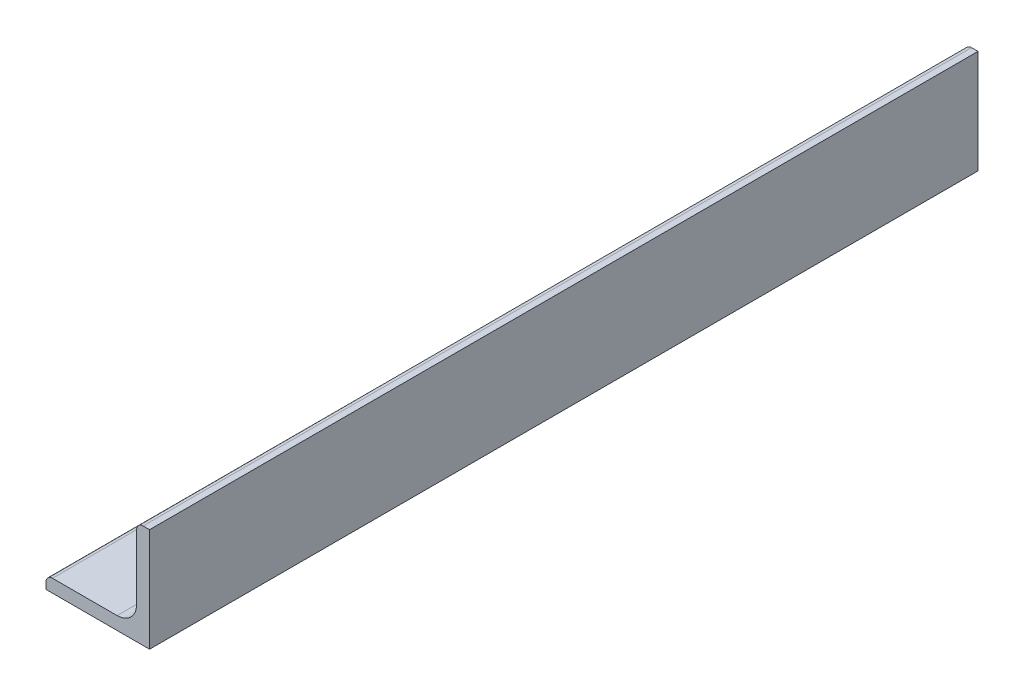
ISO-10303-21;
HEADER;
FILE_DESCRIPTION(('STEP AP214'),'2;1');
FILE_NAME('part.step','',(''),(''),'','','');
FILE_SCHEMA(('AUTOMOTIVE_DESIGN { 1 0 10303 214 1 1 1 1 }'));
ENDSEC;
DATA;
#1=APPLICATION_CONTEXT('core data for automotive mechanical design processes');
#2=APPLICATION_PROTOCOL_DEFINITION('international standard','automotive_design',2000,#1);
#3=PRODUCT_CONTEXT('',#1,'mechanical');
#4=PRODUCT('Part','Part','',(#3));
#5=PRODUCT_RELATED_PRODUCT_CATEGORY('part','',(#4));
#6=PRODUCT_DEFINITION_FORMATION('','',#4);
#7=PRODUCT_DEFINITION_CONTEXT('part definition',#1,'design');
#8=PRODUCT_DEFINITION('design','',#6,#7);
#9=PRODUCT_DEFINITION_SHAPE('','',#8);
#10=(LENGTH_UNIT() NAMED_UNIT(*) SI_UNIT(.MILLI.,.METRE.));
#11=(NAMED_UNIT(*) PLANE_ANGLE_UNIT() SI_UNIT($,.RADIAN.));
#12=(NAMED_UNIT(*) SI_UNIT($,.STERADIAN.) SOLID_ANGLE_UNIT());
#13=UNCERTAINTY_MEASURE_WITH_UNIT(LENGTH_MEASURE(1.E-05),#10,'distance_accuracy_value','');
#14=(GEOMETRIC_REPRESENTATION_CONTEXT(3) GLOBAL_UNCERTAINTY_ASSIGNED_CONTEXT((#13)) GLOBAL_UNIT_ASSIGNED_CONTEXT((#10,
#11,#12)) REPRESENTATION_CONTEXT('',''));
#15=CARTESIAN_POINT('',(0.,0.,0.));
#16=DIRECTION('',(0.,0.,1.));
#17=DIRECTION('',(1.,0.,0.));
#18=AXIS2_PLACEMENT_3D('',#15,#16,#17);
#19=CARTESIAN_POINT('',(-12.7,-11.1125,101.6));
#20=DIRECTION('',(1.,0.,0.));
#21=DIRECTION('',(0.,1.,0.));
#22=AXIS2_PLACEMENT_3D('',#19,#20,#21);
#23=PLANE('',#22);
#24=DIRECTION('',(0.,-1.,0.));
#25=VECTOR('',#24,1.);
#26=CARTESIAN_POINT('',(-12.7,-11.1125,-101.6));
#27=LINE('',#26,#25);
#28=CARTESIAN_POINT('',(-12.7,-11.1125,-101.6));
#29=VERTEX_POINT('',#28);
#30=CARTESIAN_POINT('',(-12.7,-12.7,-101.6));
#31=VERTEX_POINT('',#30);
#32=EDGE_CURVE('E152',#29,#31,#27,.T.);
#33=ORIENTED_EDGE('',*,*,#32,.T.);
#34=DIRECTION('',(0.,0.,-1.));
#35=VECTOR('',#34,1.);
#36=CARTESIAN_POINT('',(-12.7,-12.7,101.6));
#37=LINE('',#36,#35);
#38=CARTESIAN_POINT('',(-12.7,-12.7,101.6));
#39=VERTEX_POINT('',#38);
#40=EDGE_CURVE('E11',#39,#31,#37,.T.);
#41=ORIENTED_EDGE('',*,*,#40,.F.);
#42=DIRECTION('',(0.,-1.,0.));
#43=VECTOR('',#42,1.);
#44=CARTESIAN_POINT('',(-12.7,-11.1125,101.6));
#45=LINE('',#44,#43);
#46=CARTESIAN_POINT('',(-12.7,-11.1125,101.6));
#47=VERTEX_POINT('',#46);
#48=EDGE_CURVE('E177',#47,#39,#45,.T.);
#49=ORIENTED_EDGE('',*,*,#48,.F.);
#50=DIRECTION('',(0.,0.,-1.));
#51=VECTOR('',#50,1.);
#52=CARTESIAN_POINT('',(-12.7,-11.1125,101.6));
#53=LINE('',#52,#51);
#54=EDGE_CURVE('E148',#47,#29,#53,.T.);
#55=ORIENTED_EDGE('',*,*,#54,.T.);
#56=EDGE_LOOP('',(#33,#41,#49,#55));
#57=FACE_BOUND('',#56,.T.);
#58=ADVANCED_FACE('F45',(#57),#23,.F.);
#59=CARTESIAN_POINT('',(-12.7,-12.7,101.6));
#60=DIRECTION('',(0.,1.,0.));
#61=DIRECTION('',(-1.,0.,0.));
#62=AXIS2_PLACEMENT_3D('',#59,#60,#61);
#63=PLANE('',#62);
#64=DIRECTION('',(1.,0.,0.));
#65=VECTOR('',#64,1.);
#66=CARTESIAN_POINT('',(-12.7,-12.7,-101.6));
#67=LINE('',#66,#65);
#68=CARTESIAN_POINT('',(12.7,-12.7,-101.6));
#69=VERTEX_POINT('',#68);
#70=EDGE_CURVE('E156',#31,#69,#67,.T.);
#71=ORIENTED_EDGE('',*,*,#70,.T.);
#72=DIRECTION('',(0.,0.,-1.));
#73=VECTOR('',#72,1.);
#74=CARTESIAN_POINT('',(12.7,-12.7,101.6));
#75=LINE('',#74,#73);
#76=CARTESIAN_POINT('',(12.7,-12.7,101.6));
#77=VERTEX_POINT('',#76);
#78=EDGE_CURVE('E54',#77,#69,#75,.T.);
#79=ORIENTED_EDGE('',*,*,#78,.F.);
#80=DIRECTION('',(1.,0.,0.));
#81=VECTOR('',#80,1.);
#82=CARTESIAN_POINT('',(-12.7,-12.7,101.6));
#83=LINE('',#82,#81);
#84=EDGE_CURVE('E108',#39,#77,#83,.T.);
#85=ORIENTED_EDGE('',*,*,#84,.F.);
#86=ORIENTED_EDGE('',*,*,#40,.T.);
#87=EDGE_LOOP('',(#71,#79,#85,#86));
#88=FACE_BOUND('',#87,.T.);
#89=ADVANCED_FACE('F233',(#88),#63,.F.);
#90=CARTESIAN_POINT('',(12.7,-12.7,101.6));
#91=DIRECTION('',(-1.,0.,0.));
#92=DIRECTION('',(0.,-1.,0.));
#93=AXIS2_PLACEMENT_3D('',#90,#91,#92);
#94=PLANE('',#93);
#95=DIRECTION('',(0.,1.,0.));
#96=VECTOR('',#95,1.);
#97=CARTESIAN_POINT('',(12.7,-12.7,-101.6));
#98=LINE('',#97,#96);
#99=CARTESIAN_POINT('',(12.7,12.7,-101.6));
#100=VERTEX_POINT('',#99);
#101=EDGE_CURVE('E159',#69,#100,#98,.T.);
#102=ORIENTED_EDGE('',*,*,#101,.T.);
#103=DIRECTION('',(0.,0.,-1.));
#104=VECTOR('',#103,1.);
#105=CARTESIAN_POINT('',(12.7,12.7,101.6));
#106=LINE('',#105,#104);
#107=CARTESIAN_POINT('',(12.7,12.7,101.6));
#108=VERTEX_POINT('',#107);
#109=EDGE_CURVE('E192',#108,#100,#106,.T.);
#110=ORIENTED_EDGE('',*,*,#109,.F.);
#111=DIRECTION('',(0.,1.,0.));
#112=VECTOR('',#111,1.);
#113=CARTESIAN_POINT('',(12.7,-12.7,101.6));
#114=LINE('',#113,#112);
#115=EDGE_CURVE('E202',#77,#108,#114,.T.);
#116=ORIENTED_EDGE('',*,*,#115,.F.);
#117=ORIENTED_EDGE('',*,*,#78,.T.);
#118=EDGE_LOOP('',(#102,#110,#116,#117));
#119=FACE_BOUND('',#118,.T.);
#120=ADVANCED_FACE('F200',(#119),#94,.F.);
#121=CARTESIAN_POINT('',(11.1125,12.7,101.6));
#122=DIRECTION('',(0.,-1.,0.));
#123=DIRECTION('',(0.,0.,-1.));
#124=AXIS2_PLACEMENT_3D('',#121,#122,#123);
#125=PLANE('',#124);
#126=DIRECTION('',(-1.,0.,0.));
#127=VECTOR('',#126,1.);
#128=CARTESIAN_POINT('',(11.1125,12.7,-101.6));
#129=LINE('',#128,#127);
#130=CARTESIAN_POINT('',(11.1125,12.7,-101.6));
#131=VERTEX_POINT('',#130);
#132=EDGE_CURVE('E162',#100,#131,#129,.T.);
#133=ORIENTED_EDGE('',*,*,#132,.T.);
#134=DIRECTION('',(0.,0.,-1.));
#135=VECTOR('',#134,1.);
#136=CARTESIAN_POINT('',(11.1125,12.7,101.6));
#137=LINE('',#136,#135);
#138=CARTESIAN_POINT('',(11.1125,12.7,101.6));
#139=VERTEX_POINT('',#138);
#140=EDGE_CURVE('E188',#139,#131,#137,.T.);
#141=ORIENTED_EDGE('',*,*,#140,.F.);
#142=DIRECTION('',(-1.,0.,0.));
#143=VECTOR('',#142,1.);
#144=CARTESIAN_POINT('',(11.1125,12.7,101.6));
#145=LINE('',#144,#143);
#146=EDGE_CURVE('E219',#108,#139,#145,.T.);
#147=ORIENTED_EDGE('',*,*,#146,.F.);
#148=ORIENTED_EDGE('',*,*,#109,.T.);
#149=EDGE_LOOP('',(#133,#141,#147,#148));
#150=FACE_BOUND('',#149,.T.);
#151=ADVANCED_FACE('F211',(#150),#125,.F.);
#152=CARTESIAN_POINT('',(11.1125,11.1125,101.6));
#153=DIRECTION('',(0.,0.,-1.));
#154=DIRECTION('',(-1.,0.,0.));
#155=AXIS2_PLACEMENT_3D('',#152,#153,#154);
#156=CYLINDRICAL_SURFACE('',#155,1.5875);
#157=CARTESIAN_POINT('',(11.1125,11.1125,-101.6));
#158=DIRECTION('',(0.,0.,1.));
#159=DIRECTION('',(-1.,0.,0.));
#160=AXIS2_PLACEMENT_3D('',#157,#158,#159);
#161=CIRCLE('',#160,1.5875);
#162=CARTESIAN_POINT('',(9.525,11.1125,-101.6));
#163=VERTEX_POINT('',#162);
#164=EDGE_CURVE('E165',#131,#163,#161,.T.);
#165=ORIENTED_EDGE('',*,*,#164,.T.);
#166=DIRECTION('',(0.,0.,-1.));
#167=VECTOR('',#166,1.);
#168=CARTESIAN_POINT('',(9.525,11.1125,101.6));
#169=LINE('',#168,#167);
#170=CARTESIAN_POINT('',(9.525,11.1125,101.6));
#171=VERTEX_POINT('',#170);
#172=EDGE_CURVE('E184',#171,#163,#169,.T.);
#173=ORIENTED_EDGE('',*,*,#172,.F.);
#174=CARTESIAN_POINT('',(11.1125,11.1125,101.6));
#175=DIRECTION('',(0.,0.,1.));
#176=DIRECTION('',(-1.,0.,0.));
#177=AXIS2_PLACEMENT_3D('',#174,#175,#176);
#178=CIRCLE('',#177,1.5875);
#179=EDGE_CURVE('E217',#139,#171,#178,.T.);
#180=ORIENTED_EDGE('',*,*,#179,.F.);
#181=ORIENTED_EDGE('',*,*,#140,.T.);
#182=EDGE_LOOP('',(#165,#173,#180,#181));
#183=FACE_BOUND('',#182,.T.);
#184=ADVANCED_FACE('F215',(#183),#156,.T.);
#185=CARTESIAN_POINT('',(9.525,11.1125,101.6));
#186=DIRECTION('',(1.,0.,0.));
#187=DIRECTION('',(0.,0.,-1.));
#188=AXIS2_PLACEMENT_3D('',#185,#186,#187);
#189=PLANE('',#188);
#190=DIRECTION('',(0.,-1.,0.));
#191=VECTOR('',#190,1.);
#192=CARTESIAN_POINT('',(9.525,11.1125,-101.6));
#193=LINE('',#192,#191);
#194=CARTESIAN_POINT('',(9.525,-4.74979999999999,-101.6));
#195=VERTEX_POINT('',#194);
#196=EDGE_CURVE('E168',#163,#195,#193,.T.);
#197=ORIENTED_EDGE('',*,*,#196,.T.);
#198=DIRECTION('',(0.,0.,-1.));
#199=VECTOR('',#198,1.);
#200=CARTESIAN_POINT('',(9.525,-4.74979999999999,101.6));
#201=LINE('',#200,#199);
#202=CARTESIAN_POINT('',(9.525,-4.74979999999999,101.6));
#203=VERTEX_POINT('',#202);
#204=EDGE_CURVE('E141',#203,#195,#201,.T.);
#205=ORIENTED_EDGE('',*,*,#204,.F.);
#206=DIRECTION('',(0.,-1.,0.));
#207=VECTOR('',#206,1.);
#208=CARTESIAN_POINT('',(9.525,11.1125,101.6));
#209=LINE('',#208,#207);
#210=EDGE_CURVE('E130',#171,#203,#209,.T.);
#211=ORIENTED_EDGE('',*,*,#210,.F.);
#212=ORIENTED_EDGE('',*,*,#172,.T.);
#213=EDGE_LOOP('',(#197,#205,#211,#212));
#214=FACE_BOUND('',#213,.T.);
#215=ADVANCED_FACE('F245',(#214),#189,.F.);
#216=CARTESIAN_POINT('',(4.7498,-4.74979999999999,101.6));
#217=DIRECTION('',(0.,0.,-1.));
#218=DIRECTION('',(-1.,0.,0.));
#219=AXIS2_PLACEMENT_3D('',#216,#217,#218);
#220=CYLINDRICAL_SURFACE('',#219,4.7752);
#221=CARTESIAN_POINT('',(4.7498,-4.74979999999999,-101.6));
#222=DIRECTION('',(0.,0.,-1.));
#223=DIRECTION('',(-1.,0.,0.));
#224=AXIS2_PLACEMENT_3D('',#221,#222,#223);
#225=CIRCLE('',#224,4.7752);
#226=CARTESIAN_POINT('',(4.7498,-9.525,-101.6));
#227=VERTEX_POINT('',#226);
#228=EDGE_CURVE('E139',#195,#227,#225,.T.);
#229=ORIENTED_EDGE('',*,*,#228,.T.);
#230=DIRECTION('',(0.,0.,-1.));
#231=VECTOR('',#230,1.);
#232=CARTESIAN_POINT('',(4.7498,-9.525,101.6));
#233=LINE('',#232,#231);
#234=CARTESIAN_POINT('',(4.7498,-9.525,101.6));
#235=VERTEX_POINT('',#234);
#236=EDGE_CURVE('E136',#235,#227,#233,.T.);
#237=ORIENTED_EDGE('',*,*,#236,.F.);
#238=CARTESIAN_POINT('',(4.7498,-4.74979999999999,101.6));
#239=DIRECTION('',(0.,0.,-1.));
#240=DIRECTION('',(-1.,0.,0.));
#241=AXIS2_PLACEMENT_3D('',#238,#239,#240);
#242=CIRCLE('',#241,4.7752);
#243=EDGE_CURVE('E124',#203,#235,#242,.T.);
#244=ORIENTED_EDGE('',*,*,#243,.F.);
#245=ORIENTED_EDGE('',*,*,#204,.T.);
#246=EDGE_LOOP('',(#229,#237,#244,#245));
#247=FACE_BOUND('',#246,.T.);
#248=ADVANCED_FACE('F137',(#247),#220,.F.);
#249=CARTESIAN_POINT('',(4.7498,-9.525,101.6));
#250=DIRECTION('',(0.,-1.,0.));
#251=DIRECTION('',(1.,0.,0.));
#252=AXIS2_PLACEMENT_3D('',#249,#250,#251);
#253=PLANE('',#252);
#254=DIRECTION('',(-1.,0.,0.));
#255=VECTOR('',#254,1.);
#256=CARTESIAN_POINT('',(4.7498,-9.525,-101.6));
#257=LINE('',#256,#255);
#258=CARTESIAN_POINT('',(-11.1125,-9.525,-101.6));
#259=VERTEX_POINT('',#258);
#260=EDGE_CURVE('E94',#227,#259,#257,.T.);
#261=ORIENTED_EDGE('',*,*,#260,.T.);
#262=DIRECTION('',(0.,0.,-1.));
#263=VECTOR('',#262,1.);
#264=CARTESIAN_POINT('',(-11.1125,-9.525,101.6));
#265=LINE('',#264,#263);
#266=CARTESIAN_POINT('',(-11.1125,-9.525,101.6));
#267=VERTEX_POINT('',#266);
#268=EDGE_CURVE('E142',#267,#259,#265,.T.);
#269=ORIENTED_EDGE('',*,*,#268,.F.);
#270=DIRECTION('',(-1.,0.,0.));
#271=VECTOR('',#270,1.);
#272=CARTESIAN_POINT('',(4.7498,-9.525,101.6));
#273=LINE('',#272,#271);
#274=EDGE_CURVE('E128',#235,#267,#273,.T.);
#275=ORIENTED_EDGE('',*,*,#274,.F.);
#276=ORIENTED_EDGE('',*,*,#236,.T.);
#277=EDGE_LOOP('',(#261,#269,#275,#276));
#278=FACE_BOUND('',#277,.T.);
#279=ADVANCED_FACE('F144',(#278),#253,.F.);
#280=CARTESIAN_POINT('',(-11.1125,-11.1125,101.6));
#281=DIRECTION('',(0.,0.,-1.));
#282=DIRECTION('',(-1.,0.,0.));
#283=AXIS2_PLACEMENT_3D('',#280,#281,#282);
#284=CYLINDRICAL_SURFACE('',#283,1.5875);
#285=CARTESIAN_POINT('',(-11.1125,-11.1125,-101.6));
#286=DIRECTION('',(0.,0.,1.));
#287=DIRECTION('',(-1.,0.,0.));
#288=AXIS2_PLACEMENT_3D('',#285,#286,#287);
#289=CIRCLE('',#288,1.5875);
#290=EDGE_CURVE('E100',#259,#29,#289,.T.);
#291=ORIENTED_EDGE('',*,*,#290,.T.);
#292=ORIENTED_EDGE('',*,*,#54,.F.);
#293=CARTESIAN_POINT('',(-11.1125,-11.1125,101.6));
#294=DIRECTION('',(0.,0.,1.));
#295=DIRECTION('',(-1.,0.,0.));
#296=AXIS2_PLACEMENT_3D('',#293,#294,#295);
#297=CIRCLE('',#296,1.5875);
#298=EDGE_CURVE('E62',#267,#47,#297,.T.);
#299=ORIENTED_EDGE('',*,*,#298,.F.);
#300=ORIENTED_EDGE('',*,*,#268,.T.);
#301=EDGE_LOOP('',(#291,#292,#299,#300));
#302=FACE_BOUND('',#301,.T.);
#303=ADVANCED_FACE('F253',(#302),#284,.T.);
#304=CARTESIAN_POINT('',(11.1125,11.1125,101.6));
#305=DIRECTION('',(0.,0.,-1.));
#306=DIRECTION('',(-1.,0.,0.));
#307=AXIS2_PLACEMENT_3D('',#304,#305,#306);
#308=PLANE('',#307);
#309=ORIENTED_EDGE('',*,*,#48,.T.);
#310=ORIENTED_EDGE('',*,*,#84,.T.);
#311=ORIENTED_EDGE('',*,*,#115,.T.);
#312=ORIENTED_EDGE('',*,*,#146,.T.);
#313=ORIENTED_EDGE('',*,*,#179,.T.);
#314=ORIENTED_EDGE('',*,*,#210,.T.);
#315=ORIENTED_EDGE('',*,*,#243,.T.);
#316=ORIENTED_EDGE('',*,*,#274,.T.);
#317=ORIENTED_EDGE('',*,*,#298,.T.);
#318=EDGE_LOOP('',(#309,#310,#311,#312,#313,#314,#315,#316,#317));
#319=FACE_BOUND('',#318,.T.);
#320=ADVANCED_FACE('F126',(#319),#308,.F.);
#321=CARTESIAN_POINT('',(11.1125,11.1125,-101.6));
#322=DIRECTION('',(0.,0.,-1.));
#323=DIRECTION('',(-1.,0.,0.));
#324=AXIS2_PLACEMENT_3D('',#321,#322,#323);
#325=PLANE('',#324);
#326=ORIENTED_EDGE('',*,*,#32,.F.);
#327=ORIENTED_EDGE('',*,*,#290,.F.);
#328=ORIENTED_EDGE('',*,*,#260,.F.);
#329=ORIENTED_EDGE('',*,*,#228,.F.);
#330=ORIENTED_EDGE('',*,*,#196,.F.);
#331=ORIENTED_EDGE('',*,*,#164,.F.);
#332=ORIENTED_EDGE('',*,*,#132,.F.);
#333=ORIENTED_EDGE('',*,*,#101,.F.);
#334=ORIENTED_EDGE('',*,*,#70,.F.);
#335=EDGE_LOOP('',(#326,#327,#328,#329,#330,#331,#332,#333,#334));
#336=FACE_BOUND('',#335,.T.);
#337=ADVANCED_FACE('F206',(#336),#325,.T.);
#338=CLOSED_SHELL('',(#58,#89,#120,#151,#184,#215,#248,#279,#303,#320,#337));
#339=MANIFOLD_SOLID_BREP('B2',#338);
#340=ADVANCED_BREP_SHAPE_REPRESENTATION('',(#18,#339),#14);
#341=SHAPE_DEFINITION_REPRESENTATION(#9,#340);
ENDSEC;
END-ISO-10303-21;
